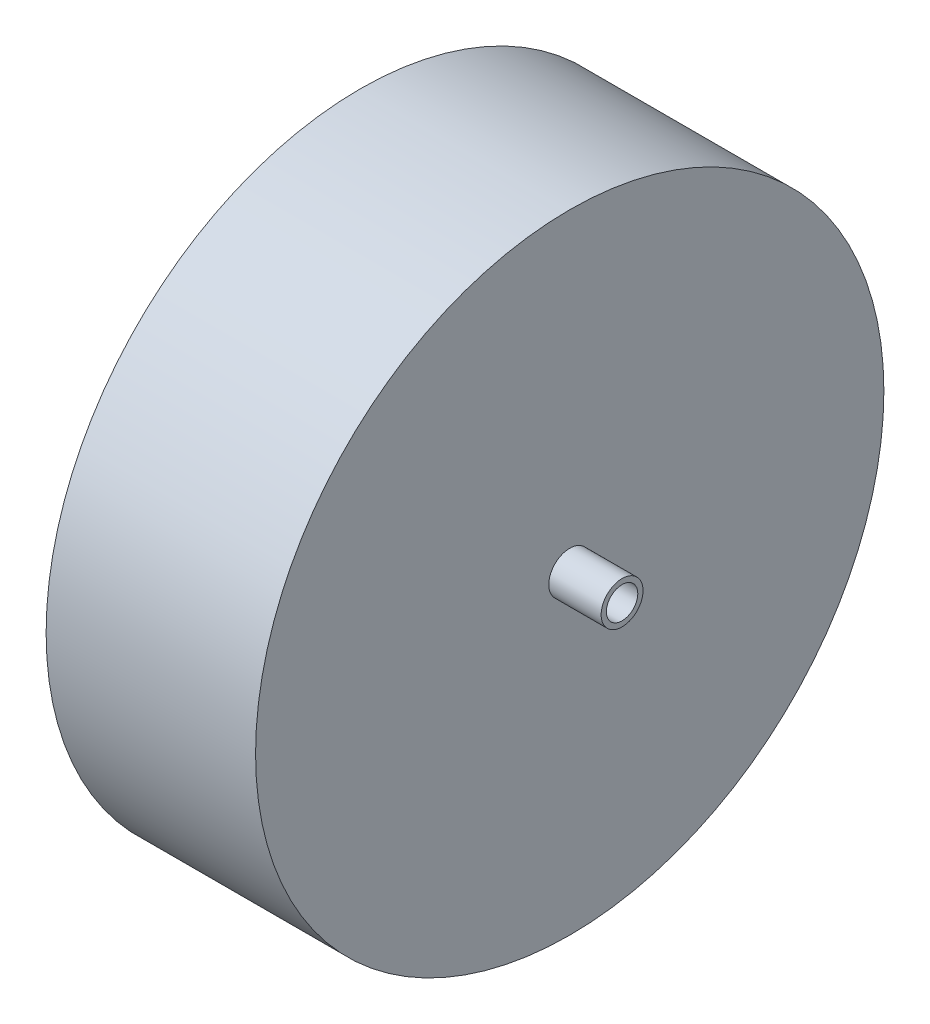
ISO-10303-21;
HEADER;
FILE_DESCRIPTION(('STEP AP214'),'2;1');
FILE_NAME('part.step','',(''),(''),'','','');
FILE_SCHEMA(('AUTOMOTIVE_DESIGN { 1 0 10303 214 1 1 1 1 }'));
ENDSEC;
DATA;
#1=APPLICATION_CONTEXT('core data for automotive mechanical design processes');
#2=APPLICATION_PROTOCOL_DEFINITION('international standard','automotive_design',2000,#1);
#3=PRODUCT_CONTEXT('',#1,'mechanical');
#4=PRODUCT('Part','Part','',(#3));
#5=PRODUCT_RELATED_PRODUCT_CATEGORY('part','',(#4));
#6=PRODUCT_DEFINITION_FORMATION('','',#4);
#7=PRODUCT_DEFINITION_CONTEXT('part definition',#1,'design');
#8=PRODUCT_DEFINITION('design','',#6,#7);
#9=PRODUCT_DEFINITION_SHAPE('','',#8);
#10=(LENGTH_UNIT() NAMED_UNIT(*) SI_UNIT(.MILLI.,.METRE.));
#11=(NAMED_UNIT(*) PLANE_ANGLE_UNIT() SI_UNIT($,.RADIAN.));
#12=(NAMED_UNIT(*) SI_UNIT($,.STERADIAN.) SOLID_ANGLE_UNIT());
#13=UNCERTAINTY_MEASURE_WITH_UNIT(LENGTH_MEASURE(1.E-05),#10,'distance_accuracy_value','');
#14=(GEOMETRIC_REPRESENTATION_CONTEXT(3) GLOBAL_UNCERTAINTY_ASSIGNED_CONTEXT((#13)) GLOBAL_UNIT_ASSIGNED_CONTEXT((#10,
#11,#12)) REPRESENTATION_CONTEXT('',''));
#15=CARTESIAN_POINT('',(0.,0.,0.));
#16=DIRECTION('',(0.,0.,1.));
#17=DIRECTION('',(1.,0.,0.));
#18=AXIS2_PLACEMENT_3D('',#15,#16,#17);
#19=CARTESIAN_POINT('',(10.,0.,0.));
#20=DIRECTION('',(1.,0.,0.));
#21=DIRECTION('',(0.,0.,-1.));
#22=AXIS2_PLACEMENT_3D('',#19,#20,#21);
#23=PLANE('',#22);
#24=CARTESIAN_POINT('',(10.,0.,0.));
#25=DIRECTION('',(1.,0.,0.));
#26=DIRECTION('',(0.,0.,-1.));
#27=AXIS2_PLACEMENT_3D('',#24,#25,#26);
#28=CIRCLE('',#27,4.);
#29=CARTESIAN_POINT('',(10.,0.,-4.));
#30=VERTEX_POINT('',#29);
#31=EDGE_CURVE('E10',#30,#30,#28,.T.);
#32=ORIENTED_EDGE('',*,*,#31,.T.);
#33=EDGE_LOOP('',(#32));
#34=FACE_BOUND('',#33,.T.);
#35=CARTESIAN_POINT('',(10.,0.,0.));
#36=DIRECTION('',(1.,0.,0.));
#37=DIRECTION('',(0.,0.,-1.));
#38=AXIS2_PLACEMENT_3D('',#35,#36,#37);
#39=CIRCLE('',#38,3.);
#40=CARTESIAN_POINT('',(10.,0.,-3.));
#41=VERTEX_POINT('',#40);
#42=EDGE_CURVE('E40',#41,#41,#39,.T.);
#43=ORIENTED_EDGE('',*,*,#42,.F.);
#44=EDGE_LOOP('',(#43));
#45=FACE_BOUND('',#44,.T.);
#46=ADVANCED_FACE('F32',(#34,#45),#23,.T.);
#47=CARTESIAN_POINT('',(10.,0.,0.));
#48=DIRECTION('',(-1.,0.,0.));
#49=DIRECTION('',(0.,0.,1.));
#50=AXIS2_PLACEMENT_3D('',#47,#48,#49);
#51=CYLINDRICAL_SURFACE('',#50,4.);
#52=ORIENTED_EDGE('',*,*,#31,.F.);
#53=EDGE_LOOP('',(#52));
#54=FACE_BOUND('',#53,.T.);
#55=CARTESIAN_POINT('',(0.,0.,0.));
#56=DIRECTION('',(1.,0.,0.));
#57=DIRECTION('',(0.,0.,-1.));
#58=AXIS2_PLACEMENT_3D('',#55,#56,#57);
#59=CIRCLE('',#58,4.);
#60=CARTESIAN_POINT('',(0.,0.,-4.));
#61=VERTEX_POINT('',#60);
#62=EDGE_CURVE('E36',#61,#61,#59,.T.);
#63=ORIENTED_EDGE('',*,*,#62,.T.);
#64=EDGE_LOOP('',(#63));
#65=FACE_BOUND('',#64,.T.);
#66=ADVANCED_FACE('F34',(#54,#65),#51,.T.);
#67=CARTESIAN_POINT('',(10.,0.,0.));
#68=DIRECTION('',(-1.,0.,0.));
#69=DIRECTION('',(0.,0.,1.));
#70=AXIS2_PLACEMENT_3D('',#67,#68,#69);
#71=CYLINDRICAL_SURFACE('',#70,3.);
#72=ORIENTED_EDGE('',*,*,#42,.T.);
#73=EDGE_LOOP('',(#72));
#74=FACE_BOUND('',#73,.T.);
#75=CARTESIAN_POINT('',(0.,0.,0.));
#76=DIRECTION('',(1.,0.,0.));
#77=DIRECTION('',(0.,0.,-1.));
#78=AXIS2_PLACEMENT_3D('',#75,#76,#77);
#79=CIRCLE('',#78,3.);
#80=CARTESIAN_POINT('',(0.,0.,-3.));
#81=VERTEX_POINT('',#80);
#82=EDGE_CURVE('E44',#81,#81,#79,.T.);
#83=ORIENTED_EDGE('',*,*,#82,.F.);
#84=EDGE_LOOP('',(#83));
#85=FACE_BOUND('',#84,.T.);
#86=ADVANCED_FACE('F77',(#74,#85),#71,.F.);
#87=CARTESIAN_POINT('',(0.,0.,0.));
#88=DIRECTION('',(-1.,0.,0.));
#89=DIRECTION('',(0.,0.,1.));
#90=AXIS2_PLACEMENT_3D('',#87,#88,#89);
#91=PLANE('',#90);
#92=ORIENTED_EDGE('',*,*,#82,.T.);
#93=EDGE_LOOP('',(#92));
#94=FACE_BOUND('',#93,.T.);
#95=ADVANCED_FACE('F65',(#94),#91,.F.);
#96=CARTESIAN_POINT('',(-40.,0.,0.));
#97=DIRECTION('',(1.,0.,0.));
#98=DIRECTION('',(0.,0.,-1.));
#99=AXIS2_PLACEMENT_3D('',#96,#97,#98);
#100=CYLINDRICAL_SURFACE('',#99,60.);
#101=CARTESIAN_POINT('',(-40.,0.,0.));
#102=DIRECTION('',(-1.,0.,0.));
#103=DIRECTION('',(0.,0.,1.));
#104=AXIS2_PLACEMENT_3D('',#101,#102,#103);
#105=CIRCLE('',#104,60.);
#106=CARTESIAN_POINT('',(-40.,0.,60.));
#107=VERTEX_POINT('',#106);
#108=EDGE_CURVE('E52',#107,#107,#105,.T.);
#109=ORIENTED_EDGE('',*,*,#108,.F.);
#110=EDGE_LOOP('',(#109));
#111=FACE_BOUND('',#110,.T.);
#112=CARTESIAN_POINT('',(0.,0.,0.));
#113=DIRECTION('',(-1.,0.,0.));
#114=DIRECTION('',(0.,0.,1.));
#115=AXIS2_PLACEMENT_3D('',#112,#113,#114);
#116=CIRCLE('',#115,60.);
#117=CARTESIAN_POINT('',(0.,0.,60.));
#118=VERTEX_POINT('',#117);
#119=EDGE_CURVE('E49',#118,#118,#116,.T.);
#120=ORIENTED_EDGE('',*,*,#119,.T.);
#121=EDGE_LOOP('',(#120));
#122=FACE_BOUND('',#121,.T.);
#123=ADVANCED_FACE('F68',(#111,#122),#100,.T.);
#124=CARTESIAN_POINT('',(-40.,0.,0.));
#125=DIRECTION('',(-1.,0.,0.));
#126=DIRECTION('',(0.,0.,1.));
#127=AXIS2_PLACEMENT_3D('',#124,#125,#126);
#128=PLANE('',#127);
#129=ORIENTED_EDGE('',*,*,#108,.T.);
#130=EDGE_LOOP('',(#129));
#131=FACE_BOUND('',#130,.T.);
#132=ADVANCED_FACE('F63',(#131),#128,.T.);
#133=ORIENTED_EDGE('',*,*,#62,.F.);
#134=EDGE_LOOP('',(#133));
#135=FACE_BOUND('',#134,.T.);
#136=ORIENTED_EDGE('',*,*,#119,.F.);
#137=EDGE_LOOP('',(#136));
#138=FACE_BOUND('',#137,.T.);
#139=ADVANCED_FACE('F60',(#135,#138),#91,.F.);
#140=CLOSED_SHELL('',(#46,#66,#86,#95,#123,#132,#139));
#141=MANIFOLD_SOLID_BREP('B2',#140);
#142=ADVANCED_BREP_SHAPE_REPRESENTATION('',(#18,#141),#14);
#143=SHAPE_DEFINITION_REPRESENTATION(#9,#142);
ENDSEC;
END-ISO-10303-21;
